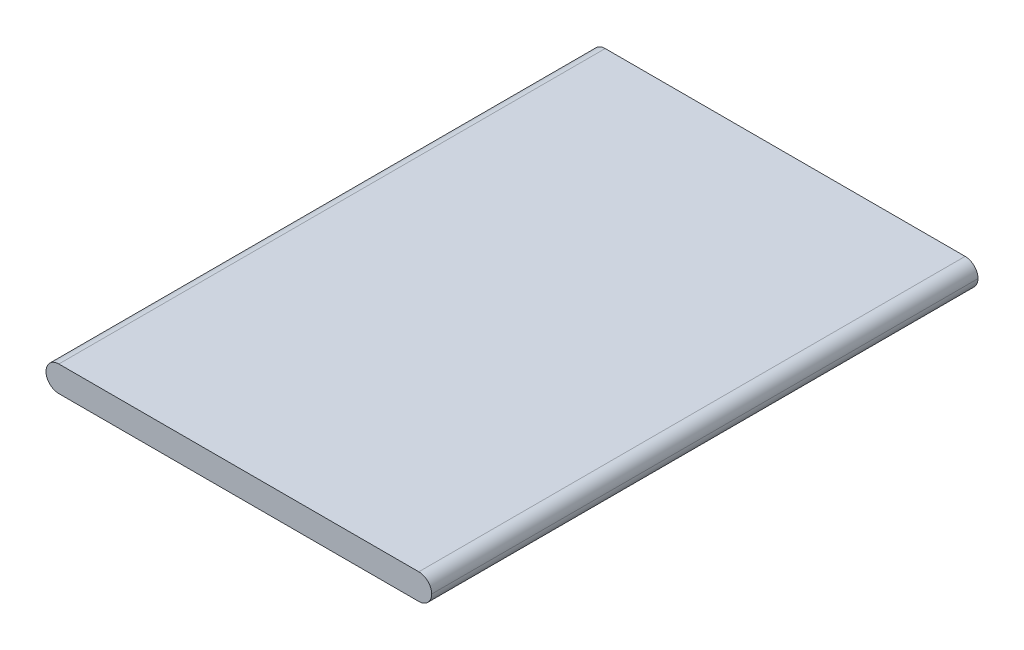
ISO-10303-21;
HEADER;
FILE_DESCRIPTION(('STEP AP214'),'2;1');
FILE_NAME('part.step','',(''),(''),'','','');
FILE_SCHEMA(('AUTOMOTIVE_DESIGN { 1 0 10303 214 1 1 1 1 }'));
ENDSEC;
DATA;
#1=APPLICATION_CONTEXT('core data for automotive mechanical design processes');
#2=APPLICATION_PROTOCOL_DEFINITION('international standard','automotive_design',2000,#1);
#3=PRODUCT_CONTEXT('',#1,'mechanical');
#4=PRODUCT('Part','Part','',(#3));
#5=PRODUCT_RELATED_PRODUCT_CATEGORY('part','',(#4));
#6=PRODUCT_DEFINITION_FORMATION('','',#4);
#7=PRODUCT_DEFINITION_CONTEXT('part definition',#1,'design');
#8=PRODUCT_DEFINITION('design','',#6,#7);
#9=PRODUCT_DEFINITION_SHAPE('','',#8);
#10=(LENGTH_UNIT() NAMED_UNIT(*) SI_UNIT(.MILLI.,.METRE.));
#11=(NAMED_UNIT(*) PLANE_ANGLE_UNIT() SI_UNIT($,.RADIAN.));
#12=(NAMED_UNIT(*) SI_UNIT($,.STERADIAN.) SOLID_ANGLE_UNIT());
#13=UNCERTAINTY_MEASURE_WITH_UNIT(LENGTH_MEASURE(1.E-05),#10,'distance_accuracy_value','');
#14=(GEOMETRIC_REPRESENTATION_CONTEXT(3) GLOBAL_UNCERTAINTY_ASSIGNED_CONTEXT((#13)) GLOBAL_UNIT_ASSIGNED_CONTEXT((#10,
#11,#12)) REPRESENTATION_CONTEXT('',''));
#15=CARTESIAN_POINT('',(0.,0.,0.));
#16=DIRECTION('',(0.,0.,1.));
#17=DIRECTION('',(1.,0.,0.));
#18=AXIS2_PLACEMENT_3D('',#15,#16,#17);
#19=CARTESIAN_POINT('',(-30.,3.99999999999999,-42.5));
#20=DIRECTION('',(0.,0.,1.));
#21=DIRECTION('',(1.,0.,0.));
#22=AXIS2_PLACEMENT_3D('',#19,#20,#21);
#23=PLANE('',#22);
#24=DIRECTION('',(-1.,0.,0.));
#25=VECTOR('',#24,1.);
#26=CARTESIAN_POINT('',(-30.,0.,-42.5));
#27=LINE('',#26,#25);
#28=CARTESIAN_POINT('',(28.,0.,-42.5));
#29=VERTEX_POINT('',#28);
#30=CARTESIAN_POINT('',(-28.,0.,-42.5));
#31=VERTEX_POINT('',#30);
#32=EDGE_CURVE('E91',#29,#31,#27,.T.);
#33=ORIENTED_EDGE('',*,*,#32,.T.);
#34=CARTESIAN_POINT('',(-28.,2.,-42.5));
#35=DIRECTION('',(0.,0.,1.));
#36=DIRECTION('',(1.,0.,0.));
#37=AXIS2_PLACEMENT_3D('',#34,#35,#36);
#38=CIRCLE('',#37,2.);
#39=CARTESIAN_POINT('',(-30.,1.99999999999999,-42.5));
#40=VERTEX_POINT('',#39);
#41=EDGE_CURVE('E117',#31,#40,#38,.F.);
#42=ORIENTED_EDGE('',*,*,#41,.T.);
#43=CARTESIAN_POINT('',(-28.,1.99999999999999,-42.5));
#44=DIRECTION('',(0.,0.,1.));
#45=DIRECTION('',(1.,0.,0.));
#46=AXIS2_PLACEMENT_3D('',#43,#44,#45);
#47=CIRCLE('',#46,2.);
#48=CARTESIAN_POINT('',(-28.,3.99999999999999,-42.5));
#49=VERTEX_POINT('',#48);
#50=EDGE_CURVE('E99',#40,#49,#47,.F.);
#51=ORIENTED_EDGE('',*,*,#50,.T.);
#52=DIRECTION('',(-1.,0.,0.));
#53=VECTOR('',#52,1.);
#54=CARTESIAN_POINT('',(-30.,3.99999999999999,-42.5));
#55=LINE('',#54,#53);
#56=CARTESIAN_POINT('',(28.,3.99999999999999,-42.5));
#57=VERTEX_POINT('',#56);
#58=EDGE_CURVE('E137',#57,#49,#55,.T.);
#59=ORIENTED_EDGE('',*,*,#58,.F.);
#60=CARTESIAN_POINT('',(28.,1.99999999999999,-42.5));
#61=DIRECTION('',(0.,0.,1.));
#62=DIRECTION('',(1.,0.,0.));
#63=AXIS2_PLACEMENT_3D('',#60,#61,#62);
#64=CIRCLE('',#63,2.);
#65=CARTESIAN_POINT('',(30.,1.99999999999999,-42.5));
#66=VERTEX_POINT('',#65);
#67=EDGE_CURVE('E94',#57,#66,#64,.F.);
#68=ORIENTED_EDGE('',*,*,#67,.T.);
#69=CARTESIAN_POINT('',(28.,2.,-42.5));
#70=DIRECTION('',(0.,0.,1.));
#71=DIRECTION('',(1.,0.,0.));
#72=AXIS2_PLACEMENT_3D('',#69,#70,#71);
#73=CIRCLE('',#72,2.);
#74=EDGE_CURVE('E89',#66,#29,#73,.F.);
#75=ORIENTED_EDGE('',*,*,#74,.T.);
#76=EDGE_LOOP('',(#33,#42,#51,#59,#68,#75));
#77=FACE_BOUND('',#76,.T.);
#78=ADVANCED_FACE('F35',(#77),#23,.F.);
#79=CARTESIAN_POINT('',(-30.,3.99999999999999,42.5));
#80=DIRECTION('',(0.,0.,-1.));
#81=DIRECTION('',(-1.,0.,0.));
#82=AXIS2_PLACEMENT_3D('',#79,#80,#81);
#83=PLANE('',#82);
#84=CARTESIAN_POINT('',(-28.,1.99999999999999,42.5));
#85=DIRECTION('',(0.,0.,-1.));
#86=DIRECTION('',(-1.,0.,0.));
#87=AXIS2_PLACEMENT_3D('',#84,#85,#86);
#88=CIRCLE('',#87,2.);
#89=CARTESIAN_POINT('',(-28.,3.99999999999999,42.5));
#90=VERTEX_POINT('',#89);
#91=CARTESIAN_POINT('',(-30.,1.99999999999999,42.5));
#92=VERTEX_POINT('',#91);
#93=EDGE_CURVE('E52',#90,#92,#88,.F.);
#94=ORIENTED_EDGE('',*,*,#93,.T.);
#95=CARTESIAN_POINT('',(-28.,2.,42.5));
#96=DIRECTION('',(0.,0.,-1.));
#97=DIRECTION('',(-1.,0.,0.));
#98=AXIS2_PLACEMENT_3D('',#95,#96,#97);
#99=CIRCLE('',#98,2.);
#100=CARTESIAN_POINT('',(-28.,0.,42.5));
#101=VERTEX_POINT('',#100);
#102=EDGE_CURVE('E123',#92,#101,#99,.F.);
#103=ORIENTED_EDGE('',*,*,#102,.T.);
#104=DIRECTION('',(1.,0.,0.));
#105=VECTOR('',#104,1.);
#106=CARTESIAN_POINT('',(-30.,0.,42.5));
#107=LINE('',#106,#105);
#108=CARTESIAN_POINT('',(28.,0.,42.5));
#109=VERTEX_POINT('',#108);
#110=EDGE_CURVE('E110',#101,#109,#107,.T.);
#111=ORIENTED_EDGE('',*,*,#110,.T.);
#112=CARTESIAN_POINT('',(28.,2.,42.5));
#113=DIRECTION('',(0.,0.,-1.));
#114=DIRECTION('',(-1.,0.,0.));
#115=AXIS2_PLACEMENT_3D('',#112,#113,#114);
#116=CIRCLE('',#115,2.);
#117=CARTESIAN_POINT('',(30.,1.99999999999999,42.5));
#118=VERTEX_POINT('',#117);
#119=EDGE_CURVE('E114',#109,#118,#116,.F.);
#120=ORIENTED_EDGE('',*,*,#119,.T.);
#121=CARTESIAN_POINT('',(28.,1.99999999999999,42.5));
#122=DIRECTION('',(0.,0.,-1.));
#123=DIRECTION('',(-1.,0.,0.));
#124=AXIS2_PLACEMENT_3D('',#121,#122,#123);
#125=CIRCLE('',#124,2.);
#126=CARTESIAN_POINT('',(28.,3.99999999999999,42.5));
#127=VERTEX_POINT('',#126);
#128=EDGE_CURVE('E58',#118,#127,#125,.F.);
#129=ORIENTED_EDGE('',*,*,#128,.T.);
#130=DIRECTION('',(1.,0.,0.));
#131=VECTOR('',#130,1.);
#132=CARTESIAN_POINT('',(-30.,3.99999999999999,42.5));
#133=LINE('',#132,#131);
#134=EDGE_CURVE('E136',#90,#127,#133,.T.);
#135=ORIENTED_EDGE('',*,*,#134,.F.);
#136=EDGE_LOOP('',(#94,#103,#111,#120,#129,#135));
#137=FACE_BOUND('',#136,.T.);
#138=ADVANCED_FACE('F154',(#137),#83,.F.);
#139=CARTESIAN_POINT('',(0.,3.99999999999999,0.));
#140=DIRECTION('',(0.,1.,0.));
#141=DIRECTION('',(0.,0.,1.));
#142=AXIS2_PLACEMENT_3D('',#139,#140,#141);
#143=PLANE('',#142);
#144=ORIENTED_EDGE('',*,*,#58,.T.);
#145=DIRECTION('',(0.,0.,1.));
#146=VECTOR('',#145,1.);
#147=CARTESIAN_POINT('',(-28.,3.99999999999999,42.5));
#148=LINE('',#147,#146);
#149=EDGE_CURVE('E11',#49,#90,#148,.T.);
#150=ORIENTED_EDGE('',*,*,#149,.T.);
#151=ORIENTED_EDGE('',*,*,#134,.T.);
#152=DIRECTION('',(0.,0.,-1.));
#153=VECTOR('',#152,1.);
#154=CARTESIAN_POINT('',(28.,3.99999999999999,-42.5));
#155=LINE('',#154,#153);
#156=EDGE_CURVE('E44',#127,#57,#155,.T.);
#157=ORIENTED_EDGE('',*,*,#156,.T.);
#158=EDGE_LOOP('',(#144,#150,#151,#157));
#159=FACE_BOUND('',#158,.T.);
#160=ADVANCED_FACE('F141',(#159),#143,.T.);
#161=CARTESIAN_POINT('',(0.,0.,0.));
#162=DIRECTION('',(0.,1.,0.));
#163=DIRECTION('',(0.,0.,1.));
#164=AXIS2_PLACEMENT_3D('',#161,#162,#163);
#165=PLANE('',#164);
#166=ORIENTED_EDGE('',*,*,#32,.F.);
#167=DIRECTION('',(0.,0.,-1.));
#168=VECTOR('',#167,1.);
#169=CARTESIAN_POINT('',(28.,0.,0.));
#170=LINE('',#169,#168);
#171=EDGE_CURVE('E106',#29,#109,#170,.F.);
#172=ORIENTED_EDGE('',*,*,#171,.T.);
#173=ORIENTED_EDGE('',*,*,#110,.F.);
#174=DIRECTION('',(0.,0.,1.));
#175=VECTOR('',#174,1.);
#176=CARTESIAN_POINT('',(-28.,0.,0.));
#177=LINE('',#176,#175);
#178=EDGE_CURVE('E109',#101,#31,#177,.F.);
#179=ORIENTED_EDGE('',*,*,#178,.T.);
#180=EDGE_LOOP('',(#166,#172,#173,#179));
#181=FACE_BOUND('',#180,.T.);
#182=ADVANCED_FACE('F104',(#181),#165,.F.);
#183=CARTESIAN_POINT('',(28.,1.99999999999999,0.));
#184=DIRECTION('',(0.,0.,1.));
#185=DIRECTION('',(1.,0.,0.));
#186=AXIS2_PLACEMENT_3D('',#183,#184,#185);
#187=CYLINDRICAL_SURFACE('',#186,2.);
#188=ORIENTED_EDGE('',*,*,#156,.F.);
#189=ORIENTED_EDGE('',*,*,#128,.F.);
#190=DIRECTION('',(0.,0.,-1.));
#191=VECTOR('',#190,1.);
#192=CARTESIAN_POINT('',(30.,1.99999999999999,42.5));
#193=LINE('',#192,#191);
#194=EDGE_CURVE('E111',#66,#118,#193,.F.);
#195=ORIENTED_EDGE('',*,*,#194,.F.);
#196=ORIENTED_EDGE('',*,*,#67,.F.);
#197=EDGE_LOOP('',(#188,#189,#195,#196));
#198=FACE_BOUND('',#197,.T.);
#199=ADVANCED_FACE('F144',(#198),#187,.T.);
#200=CARTESIAN_POINT('',(28.,2.,-42.5));
#201=DIRECTION('',(0.,0.,-1.));
#202=DIRECTION('',(-1.,0.,0.));
#203=AXIS2_PLACEMENT_3D('',#200,#201,#202);
#204=CYLINDRICAL_SURFACE('',#203,2.);
#205=ORIENTED_EDGE('',*,*,#119,.F.);
#206=ORIENTED_EDGE('',*,*,#171,.F.);
#207=ORIENTED_EDGE('',*,*,#74,.F.);
#208=ORIENTED_EDGE('',*,*,#194,.T.);
#209=EDGE_LOOP('',(#205,#206,#207,#208));
#210=FACE_BOUND('',#209,.T.);
#211=ADVANCED_FACE('F113',(#210),#204,.T.);
#212=CARTESIAN_POINT('',(-28.,1.99999999999999,0.));
#213=DIRECTION('',(0.,0.,-1.));
#214=DIRECTION('',(-1.,0.,0.));
#215=AXIS2_PLACEMENT_3D('',#212,#213,#214);
#216=CYLINDRICAL_SURFACE('',#215,2.);
#217=ORIENTED_EDGE('',*,*,#149,.F.);
#218=ORIENTED_EDGE('',*,*,#50,.F.);
#219=DIRECTION('',(0.,0.,1.));
#220=VECTOR('',#219,1.);
#221=CARTESIAN_POINT('',(-30.,1.99999999999999,-42.5));
#222=LINE('',#221,#220);
#223=EDGE_CURVE('E39',#92,#40,#222,.F.);
#224=ORIENTED_EDGE('',*,*,#223,.F.);
#225=ORIENTED_EDGE('',*,*,#93,.F.);
#226=EDGE_LOOP('',(#217,#218,#224,#225));
#227=FACE_BOUND('',#226,.T.);
#228=ADVANCED_FACE('F37',(#227),#216,.T.);
#229=CARTESIAN_POINT('',(-28.,2.,-42.5));
#230=DIRECTION('',(0.,0.,1.));
#231=DIRECTION('',(1.,0.,0.));
#232=AXIS2_PLACEMENT_3D('',#229,#230,#231);
#233=CYLINDRICAL_SURFACE('',#232,2.);
#234=ORIENTED_EDGE('',*,*,#41,.F.);
#235=ORIENTED_EDGE('',*,*,#178,.F.);
#236=ORIENTED_EDGE('',*,*,#102,.F.);
#237=ORIENTED_EDGE('',*,*,#223,.T.);
#238=EDGE_LOOP('',(#234,#235,#236,#237));
#239=FACE_BOUND('',#238,.T.);
#240=ADVANCED_FACE('F128',(#239),#233,.T.);
#241=CLOSED_SHELL('',(#78,#138,#160,#182,#199,#211,#228,#240));
#242=MANIFOLD_SOLID_BREP('B2',#241);
#243=ADVANCED_BREP_SHAPE_REPRESENTATION('',(#18,#242),#14);
#244=SHAPE_DEFINITION_REPRESENTATION(#9,#243);
ENDSEC;
END-ISO-10303-21;
